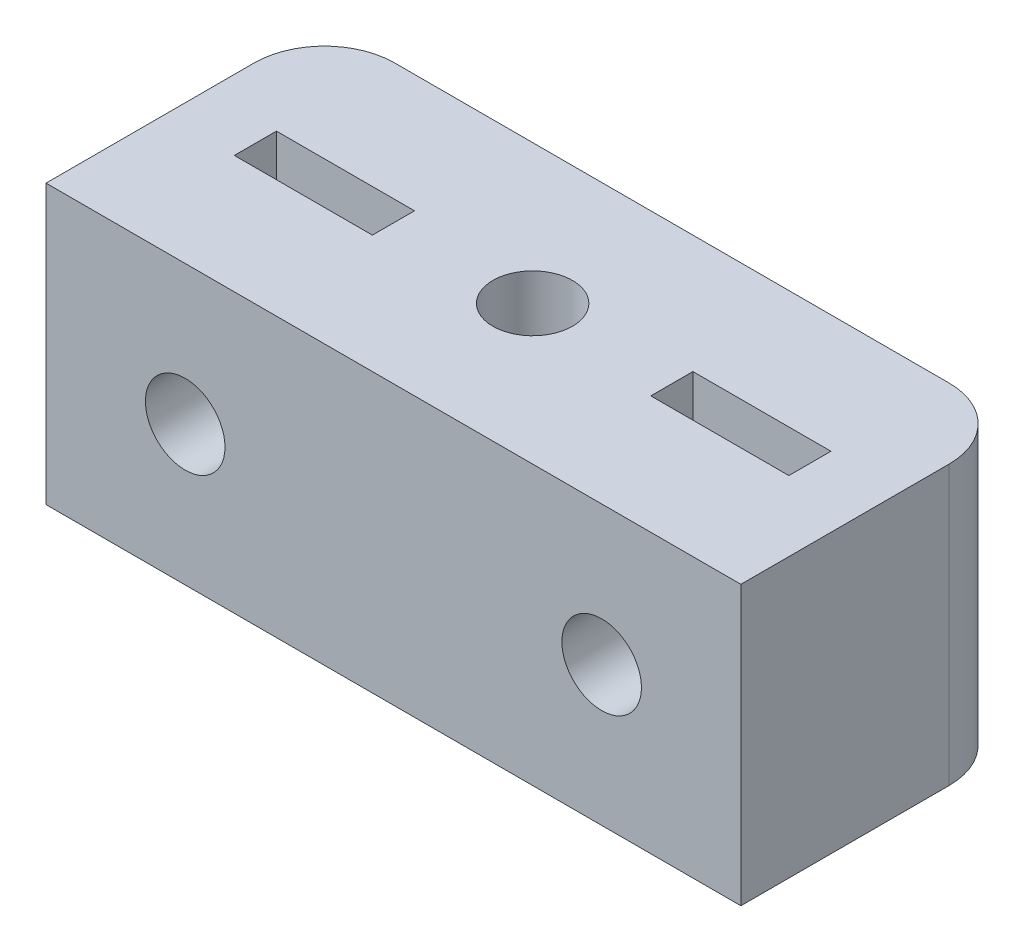
ISO-10303-21;
HEADER;
FILE_DESCRIPTION(('STEP AP214'),'2;1');
FILE_NAME('part.step','',(''),(''),'','','');
FILE_SCHEMA(('AUTOMOTIVE_DESIGN { 1 0 10303 214 1 1 1 1 }'));
ENDSEC;
DATA;
#1=APPLICATION_CONTEXT('core data for automotive mechanical design processes');
#2=APPLICATION_PROTOCOL_DEFINITION('international standard','automotive_design',2000,#1);
#3=PRODUCT_CONTEXT('',#1,'mechanical');
#4=PRODUCT('Part','Part','',(#3));
#5=PRODUCT_RELATED_PRODUCT_CATEGORY('part','',(#4));
#6=PRODUCT_DEFINITION_FORMATION('','',#4);
#7=PRODUCT_DEFINITION_CONTEXT('part definition',#1,'design');
#8=PRODUCT_DEFINITION('design','',#6,#7);
#9=PRODUCT_DEFINITION_SHAPE('','',#8);
#10=(LENGTH_UNIT() NAMED_UNIT(*) SI_UNIT(.MILLI.,.METRE.));
#11=(NAMED_UNIT(*) PLANE_ANGLE_UNIT() SI_UNIT($,.RADIAN.));
#12=(NAMED_UNIT(*) SI_UNIT($,.STERADIAN.) SOLID_ANGLE_UNIT());
#13=UNCERTAINTY_MEASURE_WITH_UNIT(LENGTH_MEASURE(1.E-05),#10,'distance_accuracy_value','');
#14=(GEOMETRIC_REPRESENTATION_CONTEXT(3) GLOBAL_UNCERTAINTY_ASSIGNED_CONTEXT((#13)) GLOBAL_UNIT_ASSIGNED_CONTEXT((#10,
#11,#12)) REPRESENTATION_CONTEXT('',''));
#15=CARTESIAN_POINT('',(0.,0.,0.));
#16=DIRECTION('',(0.,0.,1.));
#17=DIRECTION('',(1.,0.,0.));
#18=AXIS2_PLACEMENT_3D('',#15,#16,#17);
#19=CARTESIAN_POINT('',(-14.85,5.95,-5.95));
#20=DIRECTION('',(0.,0.,1.));
#21=DIRECTION('',(1.,0.,0.));
#22=AXIS2_PLACEMENT_3D('',#19,#20,#21);
#23=PLANE('',#22);
#24=DIRECTION('',(-1.,0.,0.));
#25=VECTOR('',#24,1.);
#26=CARTESIAN_POINT('',(-14.85,-5.95,-5.95));
#27=LINE('',#26,#25);
#28=CARTESIAN_POINT('',(11.85,-5.95,-5.95));
#29=VERTEX_POINT('',#28);
#30=CARTESIAN_POINT('',(-11.85,-5.95,-5.95));
#31=VERTEX_POINT('',#30);
#32=EDGE_CURVE('E301',#29,#31,#27,.T.);
#33=ORIENTED_EDGE('',*,*,#32,.T.);
#34=DIRECTION('',(0.,-1.,0.));
#35=VECTOR('',#34,1.);
#36=CARTESIAN_POINT('',(-11.85,5.95,-5.95));
#37=LINE('',#36,#35);
#38=CARTESIAN_POINT('',(-11.85,5.95,-5.95));
#39=VERTEX_POINT('',#38);
#40=EDGE_CURVE('E56',#31,#39,#37,.F.);
#41=ORIENTED_EDGE('',*,*,#40,.T.);
#42=DIRECTION('',(-1.,0.,0.));
#43=VECTOR('',#42,1.);
#44=CARTESIAN_POINT('',(-14.85,5.95,-5.95));
#45=LINE('',#44,#43);
#46=CARTESIAN_POINT('',(11.85,5.95,-5.95));
#47=VERTEX_POINT('',#46);
#48=EDGE_CURVE('E292',#47,#39,#45,.T.);
#49=ORIENTED_EDGE('',*,*,#48,.F.);
#50=DIRECTION('',(0.,-1.,0.));
#51=VECTOR('',#50,1.);
#52=CARTESIAN_POINT('',(11.85,5.95,-5.95));
#53=LINE('',#52,#51);
#54=EDGE_CURVE('E330',#47,#29,#53,.T.);
#55=ORIENTED_EDGE('',*,*,#54,.T.);
#56=EDGE_LOOP('',(#33,#41,#49,#55));
#57=FACE_BOUND('',#56,.T.);
#58=CARTESIAN_POINT('',(-8.90000000000001,0.,-5.95));
#59=DIRECTION('',(0.,0.,1.));
#60=DIRECTION('',(1.,0.,0.));
#61=AXIS2_PLACEMENT_3D('',#58,#59,#60);
#62=CIRCLE('',#61,1.7);
#63=CARTESIAN_POINT('',(-7.20000000000001,0.,-5.95));
#64=VERTEX_POINT('',#63);
#65=EDGE_CURVE('E282',#64,#64,#62,.T.);
#66=ORIENTED_EDGE('',*,*,#65,.T.);
#67=EDGE_LOOP('',(#66));
#68=FACE_BOUND('',#67,.T.);
#69=CARTESIAN_POINT('',(8.90000000000001,0.,-5.95));
#70=DIRECTION('',(0.,0.,-1.));
#71=DIRECTION('',(-1.,0.,0.));
#72=AXIS2_PLACEMENT_3D('',#69,#70,#71);
#73=CIRCLE('',#72,1.7);
#74=CARTESIAN_POINT('',(7.20000000000001,0.,-5.95));
#75=VERTEX_POINT('',#74);
#76=EDGE_CURVE('E243',#75,#75,#73,.T.);
#77=ORIENTED_EDGE('',*,*,#76,.F.);
#78=EDGE_LOOP('',(#77));
#79=FACE_BOUND('',#78,.T.);
#80=DIRECTION('',(-1.,0.,0.));
#81=VECTOR('',#80,1.);
#82=CARTESIAN_POINT('',(-2.95,-0.9,-5.95));
#83=LINE('',#82,#81);
#84=CARTESIAN_POINT('',(2.95,-0.9,-5.95));
#85=VERTEX_POINT('',#84);
#86=CARTESIAN_POINT('',(-2.95,-0.9,-5.95));
#87=VERTEX_POINT('',#86);
#88=EDGE_CURVE('E180',#85,#87,#83,.T.);
#89=ORIENTED_EDGE('',*,*,#88,.F.);
#90=DIRECTION('',(0.,1.,0.));
#91=VECTOR('',#90,1.);
#92=CARTESIAN_POINT('',(2.95,-0.9,-5.95));
#93=LINE('',#92,#91);
#94=CARTESIAN_POINT('',(2.95,0.9,-5.95));
#95=VERTEX_POINT('',#94);
#96=EDGE_CURVE('E161',#85,#95,#93,.T.);
#97=ORIENTED_EDGE('',*,*,#96,.T.);
#98=DIRECTION('',(-1.,0.,0.));
#99=VECTOR('',#98,1.);
#100=CARTESIAN_POINT('',(-2.95,0.9,-5.95));
#101=LINE('',#100,#99);
#102=CARTESIAN_POINT('',(-2.95,0.9,-5.95));
#103=VERTEX_POINT('',#102);
#104=EDGE_CURVE('E189',#95,#103,#101,.T.);
#105=ORIENTED_EDGE('',*,*,#104,.T.);
#106=DIRECTION('',(0.,1.,0.));
#107=VECTOR('',#106,1.);
#108=CARTESIAN_POINT('',(-2.95,-0.9,-5.95));
#109=LINE('',#108,#107);
#110=EDGE_CURVE('E172',#87,#103,#109,.T.);
#111=ORIENTED_EDGE('',*,*,#110,.F.);
#112=EDGE_LOOP('',(#89,#97,#105,#111));
#113=FACE_BOUND('',#112,.T.);
#114=ADVANCED_FACE('F35',(#57,#68,#79,#113),#23,.F.);
#115=CARTESIAN_POINT('',(0.,-5.95,0.));
#116=DIRECTION('',(0.,1.,0.));
#117=DIRECTION('',(0.,0.,1.));
#118=AXIS2_PLACEMENT_3D('',#115,#116,#117);
#119=CYLINDRICAL_SURFACE('',#118,1.7);
#120=CARTESIAN_POINT('',(0.,-5.95,0.));
#121=DIRECTION('',(0.,1.,0.));
#122=DIRECTION('',(0.,0.,1.));
#123=AXIS2_PLACEMENT_3D('',#120,#121,#122);
#124=CIRCLE('',#123,1.7);
#125=CARTESIAN_POINT('',(0.,-5.95,1.7));
#126=VERTEX_POINT('',#125);
#127=EDGE_CURVE('E204',#126,#126,#124,.T.);
#128=ORIENTED_EDGE('',*,*,#127,.F.);
#129=EDGE_LOOP('',(#128));
#130=FACE_BOUND('',#129,.T.);
#131=CARTESIAN_POINT('',(0.,-0.9,0.));
#132=DIRECTION('',(0.,1.,0.));
#133=DIRECTION('',(0.,0.,1.));
#134=AXIS2_PLACEMENT_3D('',#131,#132,#133);
#135=CIRCLE('',#134,1.7);
#136=CARTESIAN_POINT('',(0.,-0.9,1.7));
#137=VERTEX_POINT('',#136);
#138=EDGE_CURVE('E211',#137,#137,#135,.F.);
#139=ORIENTED_EDGE('',*,*,#138,.F.);
#140=EDGE_LOOP('',(#139));
#141=FACE_BOUND('',#140,.T.);
#142=ADVANCED_FACE('F374',(#130,#141),#119,.F.);
#143=CARTESIAN_POINT('',(0.,5.95,0.));
#144=DIRECTION('',(0.,-1.,0.));
#145=DIRECTION('',(0.,0.,-1.));
#146=AXIS2_PLACEMENT_3D('',#143,#144,#145);
#147=PLANE('',#146);
#148=CARTESIAN_POINT('',(0.,5.95,0.));
#149=DIRECTION('',(0.,1.,0.));
#150=DIRECTION('',(0.,0.,1.));
#151=AXIS2_PLACEMENT_3D('',#148,#149,#150);
#152=CIRCLE('',#151,1.7);
#153=CARTESIAN_POINT('',(0.,5.95,1.7));
#154=VERTEX_POINT('',#153);
#155=EDGE_CURVE('E208',#154,#154,#152,.T.);
#156=ORIENTED_EDGE('',*,*,#155,.F.);
#157=EDGE_LOOP('',(#156));
#158=FACE_BOUND('',#157,.T.);
#159=DIRECTION('',(-1.,0.,0.));
#160=VECTOR('',#159,1.);
#161=CARTESIAN_POINT('',(-11.85,5.95,-0.9));
#162=LINE('',#161,#160);
#163=CARTESIAN_POINT('',(-5.95000000000001,5.95,-0.9));
#164=VERTEX_POINT('',#163);
#165=CARTESIAN_POINT('',(-11.85,5.95,-0.9));
#166=VERTEX_POINT('',#165);
#167=EDGE_CURVE('E254',#164,#166,#162,.T.);
#168=ORIENTED_EDGE('',*,*,#167,.F.);
#169=DIRECTION('',(0.,0.,1.));
#170=VECTOR('',#169,1.);
#171=CARTESIAN_POINT('',(-5.95000000000001,5.95,-0.9));
#172=LINE('',#171,#170);
#173=CARTESIAN_POINT('',(-5.95000000000001,5.95,0.9));
#174=VERTEX_POINT('',#173);
#175=EDGE_CURVE('E263',#164,#174,#172,.T.);
#176=ORIENTED_EDGE('',*,*,#175,.T.);
#177=DIRECTION('',(-1.,0.,0.));
#178=VECTOR('',#177,1.);
#179=CARTESIAN_POINT('',(-11.85,5.95,0.9));
#180=LINE('',#179,#178);
#181=CARTESIAN_POINT('',(-11.85,5.95,0.9));
#182=VERTEX_POINT('',#181);
#183=EDGE_CURVE('E246',#174,#182,#180,.T.);
#184=ORIENTED_EDGE('',*,*,#183,.T.);
#185=DIRECTION('',(0.,0.,1.));
#186=VECTOR('',#185,1.);
#187=CARTESIAN_POINT('',(-11.85,5.95,-0.9));
#188=LINE('',#187,#186);
#189=EDGE_CURVE('E278',#166,#182,#188,.T.);
#190=ORIENTED_EDGE('',*,*,#189,.F.);
#191=EDGE_LOOP('',(#168,#176,#184,#190));
#192=FACE_BOUND('',#191,.T.);
#193=ORIENTED_EDGE('',*,*,#48,.T.);
#194=CARTESIAN_POINT('',(-11.85,5.95,-2.95));
#195=DIRECTION('',(0.,-1.,0.));
#196=DIRECTION('',(0.,0.,-1.));
#197=AXIS2_PLACEMENT_3D('',#194,#195,#196);
#198=CIRCLE('',#197,3.);
#199=CARTESIAN_POINT('',(-14.85,5.95,-2.95));
#200=VERTEX_POINT('',#199);
#201=EDGE_CURVE('E43',#39,#200,#198,.F.);
#202=ORIENTED_EDGE('',*,*,#201,.T.);
#203=DIRECTION('',(0.,0.,1.));
#204=VECTOR('',#203,1.);
#205=CARTESIAN_POINT('',(-14.85,5.95,5.95));
#206=LINE('',#205,#204);
#207=CARTESIAN_POINT('',(-14.85,5.95,5.95));
#208=VERTEX_POINT('',#207);
#209=EDGE_CURVE('E295',#200,#208,#206,.T.);
#210=ORIENTED_EDGE('',*,*,#209,.T.);
#211=DIRECTION('',(1.,0.,0.));
#212=VECTOR('',#211,1.);
#213=CARTESIAN_POINT('',(-14.85,5.95,5.95));
#214=LINE('',#213,#212);
#215=CARTESIAN_POINT('',(14.85,5.95,5.95));
#216=VERTEX_POINT('',#215);
#217=EDGE_CURVE('E297',#208,#216,#214,.T.);
#218=ORIENTED_EDGE('',*,*,#217,.T.);
#219=DIRECTION('',(0.,0.,-1.));
#220=VECTOR('',#219,1.);
#221=CARTESIAN_POINT('',(14.85,5.95,5.95));
#222=LINE('',#221,#220);
#223=CARTESIAN_POINT('',(14.85,5.95,-2.95));
#224=VERTEX_POINT('',#223);
#225=EDGE_CURVE('E290',#216,#224,#222,.T.);
#226=ORIENTED_EDGE('',*,*,#225,.T.);
#227=CARTESIAN_POINT('',(11.85,5.95,-2.95));
#228=DIRECTION('',(0.,-1.,0.));
#229=DIRECTION('',(0.,0.,-1.));
#230=AXIS2_PLACEMENT_3D('',#227,#228,#229);
#231=CIRCLE('',#230,3.);
#232=EDGE_CURVE('E334',#224,#47,#231,.F.);
#233=ORIENTED_EDGE('',*,*,#232,.T.);
#234=EDGE_LOOP('',(#193,#202,#210,#218,#226,#233));
#235=FACE_BOUND('',#234,.T.);
#236=DIRECTION('',(1.,0.,0.));
#237=VECTOR('',#236,1.);
#238=CARTESIAN_POINT('',(11.85,5.95,-0.9));
#239=LINE('',#238,#237);
#240=CARTESIAN_POINT('',(5.95000000000001,5.95,-0.9));
#241=VERTEX_POINT('',#240);
#242=CARTESIAN_POINT('',(11.85,5.95,-0.9));
#243=VERTEX_POINT('',#242);
#244=EDGE_CURVE('E221',#241,#243,#239,.T.);
#245=ORIENTED_EDGE('',*,*,#244,.T.);
#246=DIRECTION('',(0.,0.,1.));
#247=VECTOR('',#246,1.);
#248=CARTESIAN_POINT('',(11.85,5.95,-0.9));
#249=LINE('',#248,#247);
#250=CARTESIAN_POINT('',(11.85,5.95,0.9));
#251=VERTEX_POINT('',#250);
#252=EDGE_CURVE('E235',#243,#251,#249,.T.);
#253=ORIENTED_EDGE('',*,*,#252,.T.);
#254=DIRECTION('',(1.,0.,0.));
#255=VECTOR('',#254,1.);
#256=CARTESIAN_POINT('',(11.85,5.95,0.9));
#257=LINE('',#256,#255);
#258=CARTESIAN_POINT('',(5.95000000000001,5.95,0.9));
#259=VERTEX_POINT('',#258);
#260=EDGE_CURVE('E216',#259,#251,#257,.T.);
#261=ORIENTED_EDGE('',*,*,#260,.F.);
#262=DIRECTION('',(0.,0.,1.));
#263=VECTOR('',#262,1.);
#264=CARTESIAN_POINT('',(5.95000000000001,5.95,-0.9));
#265=LINE('',#264,#263);
#266=EDGE_CURVE('E232',#241,#259,#265,.T.);
#267=ORIENTED_EDGE('',*,*,#266,.F.);
#268=EDGE_LOOP('',(#245,#253,#261,#267));
#269=FACE_BOUND('',#268,.T.);
#270=ADVANCED_FACE('F338',(#158,#192,#235,#269),#147,.F.);
#271=CARTESIAN_POINT('',(8.90000000000001,0.,-5.95));
#272=DIRECTION('',(0.,0.,1.));
#273=DIRECTION('',(1.,0.,0.));
#274=AXIS2_PLACEMENT_3D('',#271,#272,#273);
#275=CYLINDRICAL_SURFACE('',#274,1.7);
#276=ORIENTED_EDGE('',*,*,#76,.T.);
#277=EDGE_LOOP('',(#276));
#278=FACE_BOUND('',#277,.T.);
#279=CARTESIAN_POINT('',(8.90000000000001,0.,-0.9));
#280=DIRECTION('',(0.,0.,1.));
#281=DIRECTION('',(1.,0.,0.));
#282=AXIS2_PLACEMENT_3D('',#279,#280,#281);
#283=CIRCLE('',#282,1.7);
#284=CARTESIAN_POINT('',(10.6,0.,-0.9));
#285=VERTEX_POINT('',#284);
#286=EDGE_CURVE('E250',#285,#285,#283,.T.);
#287=ORIENTED_EDGE('',*,*,#286,.T.);
#288=EDGE_LOOP('',(#287));
#289=FACE_BOUND('',#288,.T.);
#290=ADVANCED_FACE('F428',(#278,#289),#275,.F.);
#291=CARTESIAN_POINT('',(-8.90000000000001,0.,-5.95));
#292=DIRECTION('',(0.,0.,1.));
#293=DIRECTION('',(1.,0.,0.));
#294=AXIS2_PLACEMENT_3D('',#291,#292,#293);
#295=CYLINDRICAL_SURFACE('',#294,1.7);
#296=ORIENTED_EDGE('',*,*,#65,.F.);
#297=EDGE_LOOP('',(#296));
#298=FACE_BOUND('',#297,.T.);
#299=CARTESIAN_POINT('',(-8.90000000000001,0.,-0.9));
#300=DIRECTION('',(0.,0.,1.));
#301=DIRECTION('',(1.,0.,0.));
#302=AXIS2_PLACEMENT_3D('',#299,#300,#301);
#303=CIRCLE('',#302,1.7);
#304=CARTESIAN_POINT('',(-7.20000000000001,0.,-0.9));
#305=VERTEX_POINT('',#304);
#306=EDGE_CURVE('E289',#305,#305,#303,.F.);
#307=ORIENTED_EDGE('',*,*,#306,.F.);
#308=EDGE_LOOP('',(#307));
#309=FACE_BOUND('',#308,.T.);
#310=ADVANCED_FACE('F384',(#298,#309),#295,.F.);
#311=CARTESIAN_POINT('',(14.85,5.95,5.95));
#312=DIRECTION('',(-1.,0.,0.));
#313=DIRECTION('',(0.,0.,1.));
#314=AXIS2_PLACEMENT_3D('',#311,#312,#313);
#315=PLANE('',#314);
#316=DIRECTION('',(0.,0.,-1.));
#317=VECTOR('',#316,1.);
#318=CARTESIAN_POINT('',(14.85,-5.95,5.95));
#319=LINE('',#318,#317);
#320=CARTESIAN_POINT('',(14.85,-5.95,5.95));
#321=VERTEX_POINT('',#320);
#322=CARTESIAN_POINT('',(14.85,-5.95,-2.95));
#323=VERTEX_POINT('',#322);
#324=EDGE_CURVE('E285',#321,#323,#319,.T.);
#325=ORIENTED_EDGE('',*,*,#324,.T.);
#326=DIRECTION('',(0.,-1.,0.));
#327=VECTOR('',#326,1.);
#328=CARTESIAN_POINT('',(14.85,5.95,-2.95));
#329=LINE('',#328,#327);
#330=EDGE_CURVE('E11',#323,#224,#329,.F.);
#331=ORIENTED_EDGE('',*,*,#330,.T.);
#332=ORIENTED_EDGE('',*,*,#225,.F.);
#333=DIRECTION('',(0.,-1.,0.));
#334=VECTOR('',#333,1.);
#335=CARTESIAN_POINT('',(14.85,5.95,5.95));
#336=LINE('',#335,#334);
#337=EDGE_CURVE('E299',#216,#321,#336,.T.);
#338=ORIENTED_EDGE('',*,*,#337,.T.);
#339=EDGE_LOOP('',(#325,#331,#332,#338));
#340=FACE_BOUND('',#339,.T.);
#341=ADVANCED_FACE('F357',(#340),#315,.F.);
#342=CARTESIAN_POINT('',(-14.85,5.95,5.95));
#343=DIRECTION('',(1.,0.,0.));
#344=DIRECTION('',(0.,0.,-1.));
#345=AXIS2_PLACEMENT_3D('',#342,#343,#344);
#346=PLANE('',#345);
#347=ORIENTED_EDGE('',*,*,#209,.F.);
#348=DIRECTION('',(0.,-1.,0.));
#349=VECTOR('',#348,1.);
#350=CARTESIAN_POINT('',(-14.85,5.95,-2.95));
#351=LINE('',#350,#349);
#352=CARTESIAN_POINT('',(-14.85,-5.95,-2.95));
#353=VERTEX_POINT('',#352);
#354=EDGE_CURVE('E311',#200,#353,#351,.T.);
#355=ORIENTED_EDGE('',*,*,#354,.T.);
#356=DIRECTION('',(0.,0.,1.));
#357=VECTOR('',#356,1.);
#358=CARTESIAN_POINT('',(-14.85,-5.95,5.95));
#359=LINE('',#358,#357);
#360=CARTESIAN_POINT('',(-14.85,-5.95,5.95));
#361=VERTEX_POINT('',#360);
#362=EDGE_CURVE('E303',#353,#361,#359,.T.);
#363=ORIENTED_EDGE('',*,*,#362,.T.);
#364=DIRECTION('',(0.,-1.,0.));
#365=VECTOR('',#364,1.);
#366=CARTESIAN_POINT('',(-14.85,5.95,5.95));
#367=LINE('',#366,#365);
#368=EDGE_CURVE('E308',#208,#361,#367,.T.);
#369=ORIENTED_EDGE('',*,*,#368,.F.);
#370=EDGE_LOOP('',(#347,#355,#363,#369));
#371=FACE_BOUND('',#370,.T.);
#372=ADVANCED_FACE('F344',(#371),#346,.F.);
#373=CARTESIAN_POINT('',(-14.85,5.95,5.95));
#374=DIRECTION('',(0.,0.,-1.));
#375=DIRECTION('',(-1.,0.,0.));
#376=AXIS2_PLACEMENT_3D('',#373,#374,#375);
#377=PLANE('',#376);
#378=CARTESIAN_POINT('',(8.90000000000001,0.,5.95));
#379=DIRECTION('',(0.,0.,-1.));
#380=DIRECTION('',(-1.,0.,0.));
#381=AXIS2_PLACEMENT_3D('',#378,#379,#380);
#382=CIRCLE('',#381,1.7);
#383=CARTESIAN_POINT('',(7.20000000000001,0.,5.95));
#384=VERTEX_POINT('',#383);
#385=EDGE_CURVE('E247',#384,#384,#382,.T.);
#386=ORIENTED_EDGE('',*,*,#385,.T.);
#387=EDGE_LOOP('',(#386));
#388=FACE_BOUND('',#387,.T.);
#389=CARTESIAN_POINT('',(-8.90000000000001,0.,5.95));
#390=DIRECTION('',(0.,0.,1.));
#391=DIRECTION('',(1.,0.,0.));
#392=AXIS2_PLACEMENT_3D('',#389,#390,#391);
#393=CIRCLE('',#392,1.7);
#394=CARTESIAN_POINT('',(-7.20000000000001,0.,5.95));
#395=VERTEX_POINT('',#394);
#396=EDGE_CURVE('E286',#395,#395,#393,.T.);
#397=ORIENTED_EDGE('',*,*,#396,.F.);
#398=EDGE_LOOP('',(#397));
#399=FACE_BOUND('',#398,.T.);
#400=DIRECTION('',(1.,0.,0.));
#401=VECTOR('',#400,1.);
#402=CARTESIAN_POINT('',(-14.85,-5.95,5.95));
#403=LINE('',#402,#401);
#404=EDGE_CURVE('E293',#361,#321,#403,.T.);
#405=ORIENTED_EDGE('',*,*,#404,.T.);
#406=ORIENTED_EDGE('',*,*,#337,.F.);
#407=ORIENTED_EDGE('',*,*,#217,.F.);
#408=ORIENTED_EDGE('',*,*,#368,.T.);
#409=EDGE_LOOP('',(#405,#406,#407,#408));
#410=FACE_BOUND('',#409,.T.);
#411=ADVANCED_FACE('F360',(#388,#399,#410),#377,.F.);
#412=CARTESIAN_POINT('',(0.,-5.95,0.));
#413=DIRECTION('',(0.,-1.,0.));
#414=DIRECTION('',(0.,0.,-1.));
#415=AXIS2_PLACEMENT_3D('',#412,#413,#414);
#416=PLANE('',#415);
#417=ORIENTED_EDGE('',*,*,#127,.T.);
#418=EDGE_LOOP('',(#417));
#419=FACE_BOUND('',#418,.T.);
#420=ORIENTED_EDGE('',*,*,#362,.F.);
#421=CARTESIAN_POINT('',(-11.85,-5.95,-2.95));
#422=DIRECTION('',(0.,-1.,0.));
#423=DIRECTION('',(0.,0.,-1.));
#424=AXIS2_PLACEMENT_3D('',#421,#422,#423);
#425=CIRCLE('',#424,3.);
#426=EDGE_CURVE('E328',#353,#31,#425,.T.);
#427=ORIENTED_EDGE('',*,*,#426,.T.);
#428=ORIENTED_EDGE('',*,*,#32,.F.);
#429=CARTESIAN_POINT('',(11.85,-5.95,-2.95));
#430=DIRECTION('',(0.,-1.,0.));
#431=DIRECTION('',(0.,0.,-1.));
#432=AXIS2_PLACEMENT_3D('',#429,#430,#431);
#433=CIRCLE('',#432,3.);
#434=EDGE_CURVE('E326',#29,#323,#433,.T.);
#435=ORIENTED_EDGE('',*,*,#434,.T.);
#436=ORIENTED_EDGE('',*,*,#324,.F.);
#437=ORIENTED_EDGE('',*,*,#404,.F.);
#438=EDGE_LOOP('',(#420,#427,#428,#435,#436,#437));
#439=FACE_BOUND('',#438,.T.);
#440=ADVANCED_FACE('F350',(#419,#439),#416,.T.);
#441=CARTESIAN_POINT('',(-8.90000000000001,0.,0.9));
#442=DIRECTION('',(0.,0.,1.));
#443=DIRECTION('',(1.,0.,0.));
#444=AXIS2_PLACEMENT_3D('',#441,#442,#443);
#445=CIRCLE('',#444,1.7);
#446=CARTESIAN_POINT('',(-7.20000000000001,0.,0.9));
#447=VERTEX_POINT('',#446);
#448=EDGE_CURVE('E275',#447,#447,#445,.F.);
#449=ORIENTED_EDGE('',*,*,#448,.T.);
#450=EDGE_LOOP('',(#449));
#451=FACE_BOUND('',#450,.T.);
#452=ORIENTED_EDGE('',*,*,#396,.T.);
#453=EDGE_LOOP('',(#452));
#454=FACE_BOUND('',#453,.T.);
#455=ADVANCED_FACE('F368',(#451,#454),#295,.F.);
#456=CARTESIAN_POINT('',(0.,0.,-0.9));
#457=DIRECTION('',(0.,0.,1.));
#458=DIRECTION('',(1.,0.,0.));
#459=AXIS2_PLACEMENT_3D('',#456,#457,#458);
#460=PLANE('',#459);
#461=DIRECTION('',(0.,1.,0.));
#462=VECTOR('',#461,1.);
#463=CARTESIAN_POINT('',(-5.95000000000001,5.95,-0.9));
#464=LINE('',#463,#462);
#465=CARTESIAN_POINT('',(-5.95000000000001,-2.95,-0.9));
#466=VERTEX_POINT('',#465);
#467=EDGE_CURVE('E251',#466,#164,#464,.T.);
#468=ORIENTED_EDGE('',*,*,#467,.T.);
#469=ORIENTED_EDGE('',*,*,#167,.T.);
#470=DIRECTION('',(0.,-1.,0.));
#471=VECTOR('',#470,1.);
#472=CARTESIAN_POINT('',(-11.85,2.95,-0.9));
#473=LINE('',#472,#471);
#474=CARTESIAN_POINT('',(-11.85,-2.95,-0.9));
#475=VERTEX_POINT('',#474);
#476=EDGE_CURVE('E258',#166,#475,#473,.T.);
#477=ORIENTED_EDGE('',*,*,#476,.T.);
#478=DIRECTION('',(1.,0.,0.));
#479=VECTOR('',#478,1.);
#480=CARTESIAN_POINT('',(-11.85,-2.95,-0.9));
#481=LINE('',#480,#479);
#482=EDGE_CURVE('E260',#475,#466,#481,.T.);
#483=ORIENTED_EDGE('',*,*,#482,.T.);
#484=EDGE_LOOP('',(#468,#469,#477,#483));
#485=FACE_BOUND('',#484,.T.);
#486=ORIENTED_EDGE('',*,*,#306,.T.);
#487=EDGE_LOOP('',(#486));
#488=FACE_BOUND('',#487,.T.);
#489=ADVANCED_FACE('F429',(#485,#488),#460,.T.);
#490=CARTESIAN_POINT('',(0.,0.,0.9));
#491=DIRECTION('',(0.,0.,1.));
#492=DIRECTION('',(1.,0.,0.));
#493=AXIS2_PLACEMENT_3D('',#490,#491,#492);
#494=PLANE('',#493);
#495=DIRECTION('',(0.,1.,0.));
#496=VECTOR('',#495,1.);
#497=CARTESIAN_POINT('',(-5.95000000000001,-2.95,0.9));
#498=LINE('',#497,#496);
#499=CARTESIAN_POINT('',(-5.95000000000001,-2.95,0.9));
#500=VERTEX_POINT('',#499);
#501=EDGE_CURVE('E255',#500,#174,#498,.T.);
#502=ORIENTED_EDGE('',*,*,#501,.F.);
#503=DIRECTION('',(1.,0.,0.));
#504=VECTOR('',#503,1.);
#505=CARTESIAN_POINT('',(-11.85,-2.95,0.9));
#506=LINE('',#505,#504);
#507=CARTESIAN_POINT('',(-11.85,-2.95,0.9));
#508=VERTEX_POINT('',#507);
#509=EDGE_CURVE('E269',#508,#500,#506,.T.);
#510=ORIENTED_EDGE('',*,*,#509,.F.);
#511=DIRECTION('',(0.,-1.,0.));
#512=VECTOR('',#511,1.);
#513=CARTESIAN_POINT('',(-11.85,-2.95,0.9));
#514=LINE('',#513,#512);
#515=EDGE_CURVE('E266',#182,#508,#514,.T.);
#516=ORIENTED_EDGE('',*,*,#515,.F.);
#517=ORIENTED_EDGE('',*,*,#183,.F.);
#518=EDGE_LOOP('',(#502,#510,#516,#517));
#519=FACE_BOUND('',#518,.T.);
#520=ORIENTED_EDGE('',*,*,#448,.F.);
#521=EDGE_LOOP('',(#520));
#522=FACE_BOUND('',#521,.T.);
#523=ADVANCED_FACE('F432',(#519,#522),#494,.F.);
#524=CARTESIAN_POINT('',(-5.95000000000001,-2.95,-0.9));
#525=DIRECTION('',(1.,0.,0.));
#526=DIRECTION('',(0.,0.,-1.));
#527=AXIS2_PLACEMENT_3D('',#524,#525,#526);
#528=PLANE('',#527);
#529=ORIENTED_EDGE('',*,*,#501,.T.);
#530=ORIENTED_EDGE('',*,*,#175,.F.);
#531=ORIENTED_EDGE('',*,*,#467,.F.);
#532=DIRECTION('',(0.,0.,1.));
#533=VECTOR('',#532,1.);
#534=CARTESIAN_POINT('',(-5.95000000000001,-2.95,-0.9));
#535=LINE('',#534,#533);
#536=EDGE_CURVE('E273',#466,#500,#535,.T.);
#537=ORIENTED_EDGE('',*,*,#536,.T.);
#538=EDGE_LOOP('',(#529,#530,#531,#537));
#539=FACE_BOUND('',#538,.T.);
#540=ADVANCED_FACE('F436',(#539),#528,.F.);
#541=CARTESIAN_POINT('',(-11.85,-2.95,-0.9));
#542=DIRECTION('',(0.,-1.,0.));
#543=DIRECTION('',(0.,0.,-1.));
#544=AXIS2_PLACEMENT_3D('',#541,#542,#543);
#545=PLANE('',#544);
#546=ORIENTED_EDGE('',*,*,#509,.T.);
#547=ORIENTED_EDGE('',*,*,#536,.F.);
#548=ORIENTED_EDGE('',*,*,#482,.F.);
#549=DIRECTION('',(0.,0.,1.));
#550=VECTOR('',#549,1.);
#551=CARTESIAN_POINT('',(-11.85,-2.95,-0.9));
#552=LINE('',#551,#550);
#553=EDGE_CURVE('E276',#475,#508,#552,.T.);
#554=ORIENTED_EDGE('',*,*,#553,.T.);
#555=EDGE_LOOP('',(#546,#547,#548,#554));
#556=FACE_BOUND('',#555,.T.);
#557=ADVANCED_FACE('F440',(#556),#545,.F.);
#558=CARTESIAN_POINT('',(-11.85,-2.95,-0.9));
#559=DIRECTION('',(-1.,0.,0.));
#560=DIRECTION('',(0.,0.,1.));
#561=AXIS2_PLACEMENT_3D('',#558,#559,#560);
#562=PLANE('',#561);
#563=ORIENTED_EDGE('',*,*,#515,.T.);
#564=ORIENTED_EDGE('',*,*,#553,.F.);
#565=ORIENTED_EDGE('',*,*,#476,.F.);
#566=ORIENTED_EDGE('',*,*,#189,.T.);
#567=EDGE_LOOP('',(#563,#564,#565,#566));
#568=FACE_BOUND('',#567,.T.);
#569=ADVANCED_FACE('F426',(#568),#562,.F.);
#570=CARTESIAN_POINT('',(8.90000000000001,0.,0.9));
#571=DIRECTION('',(0.,0.,1.));
#572=DIRECTION('',(1.,0.,0.));
#573=AXIS2_PLACEMENT_3D('',#570,#571,#572);
#574=CIRCLE('',#573,1.7);
#575=CARTESIAN_POINT('',(10.6,0.,0.9));
#576=VERTEX_POINT('',#575);
#577=EDGE_CURVE('E234',#576,#576,#574,.T.);
#578=ORIENTED_EDGE('',*,*,#577,.F.);
#579=EDGE_LOOP('',(#578));
#580=FACE_BOUND('',#579,.T.);
#581=ORIENTED_EDGE('',*,*,#385,.F.);
#582=EDGE_LOOP('',(#581));
#583=FACE_BOUND('',#582,.T.);
#584=ADVANCED_FACE('F416',(#580,#583),#275,.F.);
#585=CARTESIAN_POINT('',(11.85,2.95,-0.9));
#586=DIRECTION('',(-1.,0.,0.));
#587=DIRECTION('',(0.,0.,1.));
#588=AXIS2_PLACEMENT_3D('',#585,#586,#587);
#589=PLANE('',#588);
#590=DIRECTION('',(0.,-1.,0.));
#591=VECTOR('',#590,1.);
#592=CARTESIAN_POINT('',(11.85,2.95,0.9));
#593=LINE('',#592,#591);
#594=CARTESIAN_POINT('',(11.85,-2.95,0.9));
#595=VERTEX_POINT('',#594);
#596=EDGE_CURVE('E229',#251,#595,#593,.T.);
#597=ORIENTED_EDGE('',*,*,#596,.F.);
#598=ORIENTED_EDGE('',*,*,#252,.F.);
#599=DIRECTION('',(0.,-1.,0.));
#600=VECTOR('',#599,1.);
#601=CARTESIAN_POINT('',(11.85,-2.95,-0.9));
#602=LINE('',#601,#600);
#603=CARTESIAN_POINT('',(11.85,-2.95,-0.9));
#604=VERTEX_POINT('',#603);
#605=EDGE_CURVE('E219',#243,#604,#602,.T.);
#606=ORIENTED_EDGE('',*,*,#605,.T.);
#607=DIRECTION('',(0.,0.,1.));
#608=VECTOR('',#607,1.);
#609=CARTESIAN_POINT('',(11.85,-2.95,-0.9));
#610=LINE('',#609,#608);
#611=EDGE_CURVE('E238',#604,#595,#610,.T.);
#612=ORIENTED_EDGE('',*,*,#611,.T.);
#613=EDGE_LOOP('',(#597,#598,#606,#612));
#614=FACE_BOUND('',#613,.T.);
#615=ADVANCED_FACE('F412',(#614),#589,.T.);
#616=CARTESIAN_POINT('',(11.85,-2.95,-0.9));
#617=DIRECTION('',(0.,1.,0.));
#618=DIRECTION('',(0.,0.,1.));
#619=AXIS2_PLACEMENT_3D('',#616,#617,#618);
#620=PLANE('',#619);
#621=DIRECTION('',(-1.,0.,0.));
#622=VECTOR('',#621,1.);
#623=CARTESIAN_POINT('',(11.85,-2.95,0.9));
#624=LINE('',#623,#622);
#625=CARTESIAN_POINT('',(5.95000000000001,-2.95,0.9));
#626=VERTEX_POINT('',#625);
#627=EDGE_CURVE('E227',#595,#626,#624,.T.);
#628=ORIENTED_EDGE('',*,*,#627,.F.);
#629=ORIENTED_EDGE('',*,*,#611,.F.);
#630=DIRECTION('',(-1.,0.,0.));
#631=VECTOR('',#630,1.);
#632=CARTESIAN_POINT('',(11.85,-2.95,-0.9));
#633=LINE('',#632,#631);
#634=CARTESIAN_POINT('',(5.95000000000001,-2.95,-0.9));
#635=VERTEX_POINT('',#634);
#636=EDGE_CURVE('E215',#604,#635,#633,.T.);
#637=ORIENTED_EDGE('',*,*,#636,.T.);
#638=DIRECTION('',(0.,0.,1.));
#639=VECTOR('',#638,1.);
#640=CARTESIAN_POINT('',(5.95000000000001,-2.95,-0.9));
#641=LINE('',#640,#639);
#642=EDGE_CURVE('E224',#635,#626,#641,.T.);
#643=ORIENTED_EDGE('',*,*,#642,.T.);
#644=EDGE_LOOP('',(#628,#629,#637,#643));
#645=FACE_BOUND('',#644,.T.);
#646=ADVANCED_FACE('F415',(#645),#620,.T.);
#647=CARTESIAN_POINT('',(5.95000000000001,-2.95,-0.9));
#648=DIRECTION('',(1.,0.,0.));
#649=DIRECTION('',(0.,0.,-1.));
#650=AXIS2_PLACEMENT_3D('',#647,#648,#649);
#651=PLANE('',#650);
#652=DIRECTION('',(0.,1.,0.));
#653=VECTOR('',#652,1.);
#654=CARTESIAN_POINT('',(5.95000000000001,-2.95,0.9));
#655=LINE('',#654,#653);
#656=EDGE_CURVE('E207',#626,#259,#655,.T.);
#657=ORIENTED_EDGE('',*,*,#656,.F.);
#658=ORIENTED_EDGE('',*,*,#642,.F.);
#659=DIRECTION('',(0.,1.,0.));
#660=VECTOR('',#659,1.);
#661=CARTESIAN_POINT('',(5.95000000000001,5.95,-0.9));
#662=LINE('',#661,#660);
#663=EDGE_CURVE('E212',#635,#241,#662,.T.);
#664=ORIENTED_EDGE('',*,*,#663,.T.);
#665=ORIENTED_EDGE('',*,*,#266,.T.);
#666=EDGE_LOOP('',(#657,#658,#664,#665));
#667=FACE_BOUND('',#666,.T.);
#668=ADVANCED_FACE('F407',(#667),#651,.T.);
#669=CARTESIAN_POINT('',(0.,0.,-0.9));
#670=DIRECTION('',(0.,0.,1.));
#671=DIRECTION('',(-1.,0.,0.));
#672=AXIS2_PLACEMENT_3D('',#669,#670,#671);
#673=PLANE('',#672);
#674=ORIENTED_EDGE('',*,*,#286,.F.);
#675=EDGE_LOOP('',(#674));
#676=FACE_BOUND('',#675,.T.);
#677=ORIENTED_EDGE('',*,*,#663,.F.);
#678=ORIENTED_EDGE('',*,*,#636,.F.);
#679=ORIENTED_EDGE('',*,*,#605,.F.);
#680=ORIENTED_EDGE('',*,*,#244,.F.);
#681=EDGE_LOOP('',(#677,#678,#679,#680));
#682=FACE_BOUND('',#681,.T.);
#683=ADVANCED_FACE('F404',(#676,#682),#673,.T.);
#684=CARTESIAN_POINT('',(0.,0.,0.9));
#685=DIRECTION('',(0.,0.,1.));
#686=DIRECTION('',(-1.,0.,0.));
#687=AXIS2_PLACEMENT_3D('',#684,#685,#686);
#688=PLANE('',#687);
#689=ORIENTED_EDGE('',*,*,#577,.T.);
#690=EDGE_LOOP('',(#689));
#691=FACE_BOUND('',#690,.T.);
#692=ORIENTED_EDGE('',*,*,#260,.T.);
#693=ORIENTED_EDGE('',*,*,#596,.T.);
#694=ORIENTED_EDGE('',*,*,#627,.T.);
#695=ORIENTED_EDGE('',*,*,#656,.T.);
#696=EDGE_LOOP('',(#692,#693,#694,#695));
#697=FACE_BOUND('',#696,.T.);
#698=ADVANCED_FACE('F402',(#691,#697),#688,.F.);
#699=CARTESIAN_POINT('',(0.,0.9,0.));
#700=DIRECTION('',(0.,1.,0.));
#701=DIRECTION('',(0.,0.,1.));
#702=AXIS2_PLACEMENT_3D('',#699,#700,#701);
#703=CIRCLE('',#702,1.7);
#704=CARTESIAN_POINT('',(0.,0.9,1.7));
#705=VERTEX_POINT('',#704);
#706=EDGE_CURVE('E200',#705,#705,#703,.F.);
#707=ORIENTED_EDGE('',*,*,#706,.T.);
#708=EDGE_LOOP('',(#707));
#709=FACE_BOUND('',#708,.T.);
#710=ORIENTED_EDGE('',*,*,#155,.T.);
#711=EDGE_LOOP('',(#710));
#712=FACE_BOUND('',#711,.T.);
#713=ADVANCED_FACE('F381',(#709,#712),#119,.F.);
#714=CARTESIAN_POINT('',(0.,-0.9,0.));
#715=DIRECTION('',(0.,1.,0.));
#716=DIRECTION('',(0.,0.,1.));
#717=AXIS2_PLACEMENT_3D('',#714,#715,#716);
#718=PLANE('',#717);
#719=DIRECTION('',(0.,0.,-1.));
#720=VECTOR('',#719,1.);
#721=CARTESIAN_POINT('',(2.95,-0.9,-5.95));
#722=LINE('',#721,#720);
#723=CARTESIAN_POINT('',(2.95,-0.9,2.95));
#724=VERTEX_POINT('',#723);
#725=EDGE_CURVE('E164',#724,#85,#722,.T.);
#726=ORIENTED_EDGE('',*,*,#725,.T.);
#727=ORIENTED_EDGE('',*,*,#88,.T.);
#728=DIRECTION('',(0.,0.,1.));
#729=VECTOR('',#728,1.);
#730=CARTESIAN_POINT('',(-2.95,-0.9,-2.95));
#731=LINE('',#730,#729);
#732=CARTESIAN_POINT('',(-2.95,-0.9,2.95));
#733=VERTEX_POINT('',#732);
#734=EDGE_CURVE('E184',#87,#733,#731,.T.);
#735=ORIENTED_EDGE('',*,*,#734,.T.);
#736=DIRECTION('',(1.,0.,0.));
#737=VECTOR('',#736,1.);
#738=CARTESIAN_POINT('',(-2.95,-0.9,2.95));
#739=LINE('',#738,#737);
#740=EDGE_CURVE('E173',#733,#724,#739,.T.);
#741=ORIENTED_EDGE('',*,*,#740,.T.);
#742=EDGE_LOOP('',(#726,#727,#735,#741));
#743=FACE_BOUND('',#742,.T.);
#744=ORIENTED_EDGE('',*,*,#138,.T.);
#745=EDGE_LOOP('',(#744));
#746=FACE_BOUND('',#745,.T.);
#747=ADVANCED_FACE('F178',(#743,#746),#718,.T.);
#748=CARTESIAN_POINT('',(0.,0.9,0.));
#749=DIRECTION('',(0.,1.,0.));
#750=DIRECTION('',(0.,0.,1.));
#751=AXIS2_PLACEMENT_3D('',#748,#749,#750);
#752=PLANE('',#751);
#753=DIRECTION('',(0.,0.,-1.));
#754=VECTOR('',#753,1.);
#755=CARTESIAN_POINT('',(2.95,0.9,2.95));
#756=LINE('',#755,#754);
#757=CARTESIAN_POINT('',(2.95,0.9,2.95));
#758=VERTEX_POINT('',#757);
#759=EDGE_CURVE('E167',#758,#95,#756,.T.);
#760=ORIENTED_EDGE('',*,*,#759,.F.);
#761=DIRECTION('',(1.,0.,0.));
#762=VECTOR('',#761,1.);
#763=CARTESIAN_POINT('',(-2.95,0.9,2.95));
#764=LINE('',#763,#762);
#765=CARTESIAN_POINT('',(-2.95,0.9,2.95));
#766=VERTEX_POINT('',#765);
#767=EDGE_CURVE('E194',#766,#758,#764,.T.);
#768=ORIENTED_EDGE('',*,*,#767,.F.);
#769=DIRECTION('',(0.,0.,1.));
#770=VECTOR('',#769,1.);
#771=CARTESIAN_POINT('',(-2.95,0.9,2.95));
#772=LINE('',#771,#770);
#773=EDGE_CURVE('E191',#103,#766,#772,.T.);
#774=ORIENTED_EDGE('',*,*,#773,.F.);
#775=ORIENTED_EDGE('',*,*,#104,.F.);
#776=EDGE_LOOP('',(#760,#768,#774,#775));
#777=FACE_BOUND('',#776,.T.);
#778=ORIENTED_EDGE('',*,*,#706,.F.);
#779=EDGE_LOOP('',(#778));
#780=FACE_BOUND('',#779,.T.);
#781=ADVANCED_FACE('F600',(#777,#780),#752,.F.);
#782=CARTESIAN_POINT('',(2.95,-0.9,2.95));
#783=DIRECTION('',(1.,0.,0.));
#784=DIRECTION('',(0.,0.,-1.));
#785=AXIS2_PLACEMENT_3D('',#782,#783,#784);
#786=PLANE('',#785);
#787=ORIENTED_EDGE('',*,*,#759,.T.);
#788=ORIENTED_EDGE('',*,*,#96,.F.);
#789=ORIENTED_EDGE('',*,*,#725,.F.);
#790=DIRECTION('',(0.,1.,0.));
#791=VECTOR('',#790,1.);
#792=CARTESIAN_POINT('',(2.95,-0.9,2.95));
#793=LINE('',#792,#791);
#794=EDGE_CURVE('E198',#724,#758,#793,.T.);
#795=ORIENTED_EDGE('',*,*,#794,.T.);
#796=EDGE_LOOP('',(#787,#788,#789,#795));
#797=FACE_BOUND('',#796,.T.);
#798=ADVANCED_FACE('F163',(#797),#786,.F.);
#799=CARTESIAN_POINT('',(-2.95,-0.9,2.95));
#800=DIRECTION('',(0.,0.,1.));
#801=DIRECTION('',(1.,0.,0.));
#802=AXIS2_PLACEMENT_3D('',#799,#800,#801);
#803=PLANE('',#802);
#804=ORIENTED_EDGE('',*,*,#767,.T.);
#805=ORIENTED_EDGE('',*,*,#794,.F.);
#806=ORIENTED_EDGE('',*,*,#740,.F.);
#807=DIRECTION('',(0.,1.,0.));
#808=VECTOR('',#807,1.);
#809=CARTESIAN_POINT('',(-2.95,-0.9,2.95));
#810=LINE('',#809,#808);
#811=EDGE_CURVE('E201',#733,#766,#810,.T.);
#812=ORIENTED_EDGE('',*,*,#811,.T.);
#813=EDGE_LOOP('',(#804,#805,#806,#812));
#814=FACE_BOUND('',#813,.T.);
#815=ADVANCED_FACE('F391',(#814),#803,.F.);
#816=CARTESIAN_POINT('',(-2.95,-0.9,2.95));
#817=DIRECTION('',(-1.,0.,0.));
#818=DIRECTION('',(0.,0.,1.));
#819=AXIS2_PLACEMENT_3D('',#816,#817,#818);
#820=PLANE('',#819);
#821=ORIENTED_EDGE('',*,*,#773,.T.);
#822=ORIENTED_EDGE('',*,*,#811,.F.);
#823=ORIENTED_EDGE('',*,*,#734,.F.);
#824=ORIENTED_EDGE('',*,*,#110,.T.);
#825=EDGE_LOOP('',(#821,#822,#823,#824));
#826=FACE_BOUND('',#825,.T.);
#827=ADVANCED_FACE('F386',(#826),#820,.F.);
#828=CARTESIAN_POINT('',(-11.85,5.95,-2.95));
#829=DIRECTION('',(0.,-1.,0.));
#830=DIRECTION('',(0.,0.,-1.));
#831=AXIS2_PLACEMENT_3D('',#828,#829,#830);
#832=CYLINDRICAL_SURFACE('',#831,3.);
#833=ORIENTED_EDGE('',*,*,#201,.F.);
#834=ORIENTED_EDGE('',*,*,#40,.F.);
#835=ORIENTED_EDGE('',*,*,#426,.F.);
#836=ORIENTED_EDGE('',*,*,#354,.F.);
#837=EDGE_LOOP('',(#833,#834,#835,#836));
#838=FACE_BOUND('',#837,.T.);
#839=ADVANCED_FACE('F347',(#838),#832,.T.);
#840=CARTESIAN_POINT('',(11.85,5.95,-2.95));
#841=DIRECTION('',(0.,-1.,0.));
#842=DIRECTION('',(0.,0.,-1.));
#843=AXIS2_PLACEMENT_3D('',#840,#841,#842);
#844=CYLINDRICAL_SURFACE('',#843,3.);
#845=ORIENTED_EDGE('',*,*,#232,.F.);
#846=ORIENTED_EDGE('',*,*,#330,.F.);
#847=ORIENTED_EDGE('',*,*,#434,.F.);
#848=ORIENTED_EDGE('',*,*,#54,.F.);
#849=EDGE_LOOP('',(#845,#846,#847,#848));
#850=FACE_BOUND('',#849,.T.);
#851=ADVANCED_FACE('F37',(#850),#844,.T.);
#852=CLOSED_SHELL('',(#114,#142,#270,#290,#310,#341,#372,#411,#440,#455,#489,#523,#540,#557,
#569,#584,#615,#646,#668,#683,#698,#713,#747,#781,#798,#815,#827,#839,#851));
#853=MANIFOLD_SOLID_BREP('B2',#852);
#854=ADVANCED_BREP_SHAPE_REPRESENTATION('',(#18,#853),#14);
#855=SHAPE_DEFINITION_REPRESENTATION(#9,#854);
ENDSEC;
END-ISO-10303-21;
